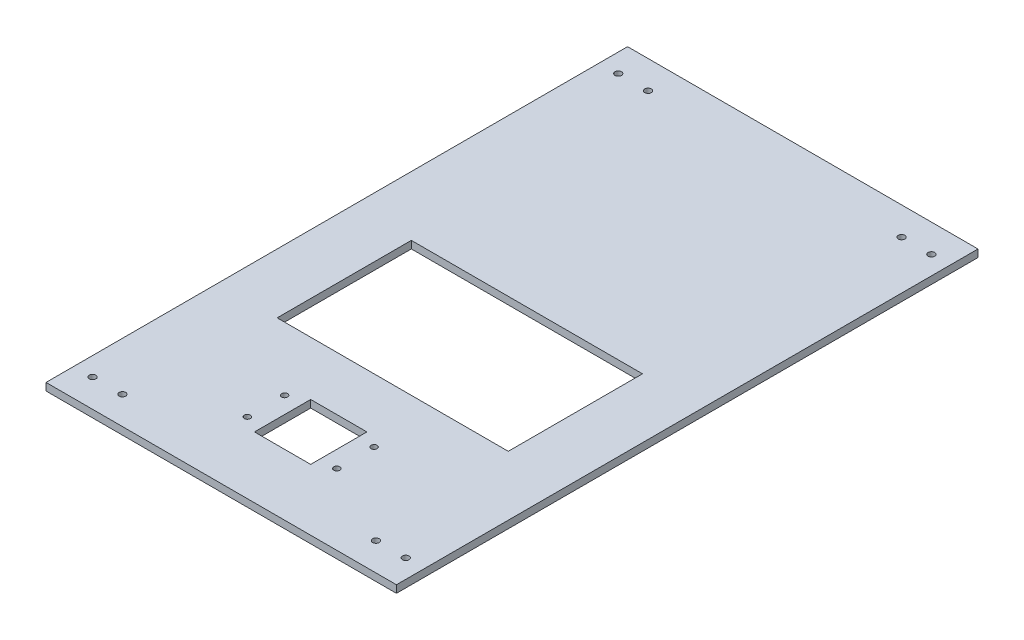
ISO-10303-21;
HEADER;
FILE_DESCRIPTION(('STEP AP214'),'2;1');
FILE_NAME('part.step','',(''),(''),'','','');
FILE_SCHEMA(('AUTOMOTIVE_DESIGN { 1 0 10303 214 1 1 1 1 }'));
ENDSEC;
DATA;
#1=APPLICATION_CONTEXT('core data for automotive mechanical design processes');
#2=APPLICATION_PROTOCOL_DEFINITION('international standard','automotive_design',2000,#1);
#3=PRODUCT_CONTEXT('',#1,'mechanical');
#4=PRODUCT('Part','Part','',(#3));
#5=PRODUCT_RELATED_PRODUCT_CATEGORY('part','',(#4));
#6=PRODUCT_DEFINITION_FORMATION('','',#4);
#7=PRODUCT_DEFINITION_CONTEXT('part definition',#1,'design');
#8=PRODUCT_DEFINITION('design','',#6,#7);
#9=PRODUCT_DEFINITION_SHAPE('','',#8);
#10=(LENGTH_UNIT() NAMED_UNIT(*) SI_UNIT(.MILLI.,.METRE.));
#11=(NAMED_UNIT(*) PLANE_ANGLE_UNIT() SI_UNIT($,.RADIAN.));
#12=(NAMED_UNIT(*) SI_UNIT($,.STERADIAN.) SOLID_ANGLE_UNIT());
#13=UNCERTAINTY_MEASURE_WITH_UNIT(LENGTH_MEASURE(1.E-05),#10,'distance_accuracy_value','');
#14=(GEOMETRIC_REPRESENTATION_CONTEXT(3) GLOBAL_UNCERTAINTY_ASSIGNED_CONTEXT((#13)) GLOBAL_UNIT_ASSIGNED_CONTEXT((#10,
#11,#12)) REPRESENTATION_CONTEXT('',''));
#15=CARTESIAN_POINT('',(0.,0.,0.));
#16=DIRECTION('',(0.,0.,1.));
#17=DIRECTION('',(1.,0.,0.));
#18=AXIS2_PLACEMENT_3D('',#15,#16,#17);
#19=CARTESIAN_POINT('',(0.,-3.175,0.));
#20=DIRECTION('',(0.,1.,0.));
#21=DIRECTION('',(0.,0.,1.));
#22=AXIS2_PLACEMENT_3D('',#19,#20,#21);
#23=PLANE('',#22);
#24=CARTESIAN_POINT('',(38.1,-3.175,155.575));
#25=DIRECTION('',(0.,-1.,0.));
#26=DIRECTION('',(0.,0.,-1.));
#27=AXIS2_PLACEMENT_3D('',#24,#25,#26);
#28=CIRCLE('',#27,2.5527);
#29=CARTESIAN_POINT('',(38.1,-3.175,153.0223));
#30=VERTEX_POINT('',#29);
#31=EDGE_CURVE('E284',#30,#30,#28,.T.);
#32=ORIENTED_EDGE('',*,*,#31,.F.);
#33=EDGE_LOOP('',(#32));
#34=FACE_BOUND('',#33,.T.);
#35=CARTESIAN_POINT('',(-38.1,-3.175,155.575));
#36=DIRECTION('',(0.,-1.,0.));
#37=DIRECTION('',(0.,0.,-1.));
#38=AXIS2_PLACEMENT_3D('',#35,#36,#37);
#39=CIRCLE('',#38,2.5527);
#40=CARTESIAN_POINT('',(-38.1,-3.175,153.0223));
#41=VERTEX_POINT('',#40);
#42=EDGE_CURVE('E273',#41,#41,#39,.T.);
#43=ORIENTED_EDGE('',*,*,#42,.F.);
#44=EDGE_LOOP('',(#43));
#45=FACE_BOUND('',#44,.T.);
#46=CARTESIAN_POINT('',(-38.1,-3.175,187.325));
#47=DIRECTION('',(0.,-1.,0.));
#48=DIRECTION('',(0.,0.,-1.));
#49=AXIS2_PLACEMENT_3D('',#46,#47,#48);
#50=CIRCLE('',#49,2.5527);
#51=CARTESIAN_POINT('',(-38.1,-3.175,184.7723));
#52=VERTEX_POINT('',#51);
#53=EDGE_CURVE('E272',#52,#52,#50,.T.);
#54=ORIENTED_EDGE('',*,*,#53,.F.);
#55=EDGE_LOOP('',(#54));
#56=FACE_BOUND('',#55,.T.);
#57=CARTESIAN_POINT('',(38.1,-3.175,187.325));
#58=DIRECTION('',(0.,-1.,0.));
#59=DIRECTION('',(0.,0.,-1.));
#60=AXIS2_PLACEMENT_3D('',#57,#58,#59);
#61=CIRCLE('',#60,2.5527);
#62=CARTESIAN_POINT('',(38.1,-3.175,184.7723));
#63=VERTEX_POINT('',#62);
#64=EDGE_CURVE('E288',#63,#63,#61,.T.);
#65=ORIENTED_EDGE('',*,*,#64,.F.);
#66=EDGE_LOOP('',(#65));
#67=FACE_BOUND('',#66,.T.);
#68=DIRECTION('',(-1.,0.,0.));
#69=VECTOR('',#68,1.);
#70=CARTESIAN_POINT('',(23.9395,-3.175,195.3895));
#71=LINE('',#70,#69);
#72=CARTESIAN_POINT('',(23.9395,-3.175,195.3895));
#73=VERTEX_POINT('',#72);
#74=CARTESIAN_POINT('',(-23.9395,-3.175,195.3895));
#75=VERTEX_POINT('',#74);
#76=EDGE_CURVE('E154',#73,#75,#71,.T.);
#77=ORIENTED_EDGE('',*,*,#76,.F.);
#78=DIRECTION('',(0.,0.,1.));
#79=VECTOR('',#78,1.);
#80=CARTESIAN_POINT('',(23.9395,-3.175,147.5105));
#81=LINE('',#80,#79);
#82=CARTESIAN_POINT('',(23.9395,-3.175,147.5105));
#83=VERTEX_POINT('',#82);
#84=EDGE_CURVE('E52',#83,#73,#81,.T.);
#85=ORIENTED_EDGE('',*,*,#84,.F.);
#86=DIRECTION('',(-1.,0.,0.));
#87=VECTOR('',#86,1.);
#88=CARTESIAN_POINT('',(23.9395,-3.175,147.5105));
#89=LINE('',#88,#87);
#90=CARTESIAN_POINT('',(-23.9395,-3.175,147.5105));
#91=VERTEX_POINT('',#90);
#92=EDGE_CURVE('E142',#83,#91,#89,.T.);
#93=ORIENTED_EDGE('',*,*,#92,.T.);
#94=DIRECTION('',(0.,0.,1.));
#95=VECTOR('',#94,1.);
#96=CARTESIAN_POINT('',(-23.9395,-3.175,147.5105));
#97=LINE('',#96,#95);
#98=EDGE_CURVE('E145',#91,#75,#97,.T.);
#99=ORIENTED_EDGE('',*,*,#98,.T.);
#100=EDGE_LOOP('',(#77,#85,#93,#99));
#101=FACE_BOUND('',#100,.T.);
#102=CARTESIAN_POINT('',(-107.95,-3.175,223.8375));
#103=DIRECTION('',(0.,-1.,0.));
#104=DIRECTION('',(0.,0.,-1.));
#105=AXIS2_PLACEMENT_3D('',#102,#103,#104);
#106=CIRCLE('',#105,2.8067);
#107=CARTESIAN_POINT('',(-107.95,-3.175,221.0308));
#108=VERTEX_POINT('',#107);
#109=EDGE_CURVE('E160',#108,#108,#106,.T.);
#110=ORIENTED_EDGE('',*,*,#109,.F.);
#111=EDGE_LOOP('',(#110));
#112=FACE_BOUND('',#111,.T.);
#113=CARTESIAN_POINT('',(-133.35,-3.175,223.8375));
#114=DIRECTION('',(0.,-1.,0.));
#115=DIRECTION('',(0.,0.,-1.));
#116=AXIS2_PLACEMENT_3D('',#113,#114,#115);
#117=CIRCLE('',#116,2.8067);
#118=CARTESIAN_POINT('',(-133.35,-3.175,221.0308));
#119=VERTEX_POINT('',#118);
#120=EDGE_CURVE('E169',#119,#119,#117,.T.);
#121=ORIENTED_EDGE('',*,*,#120,.F.);
#122=EDGE_LOOP('',(#121));
#123=FACE_BOUND('',#122,.T.);
#124=CARTESIAN_POINT('',(-133.35,-3.175,-223.8375));
#125=DIRECTION('',(0.,-1.,0.));
#126=DIRECTION('',(0.,0.,-1.));
#127=AXIS2_PLACEMENT_3D('',#124,#125,#126);
#128=CIRCLE('',#127,2.8067);
#129=CARTESIAN_POINT('',(-133.35,-3.175,-226.6442));
#130=VERTEX_POINT('',#129);
#131=EDGE_CURVE('E173',#130,#130,#128,.T.);
#132=ORIENTED_EDGE('',*,*,#131,.F.);
#133=EDGE_LOOP('',(#132));
#134=FACE_BOUND('',#133,.T.);
#135=CARTESIAN_POINT('',(-107.95,-3.175,-223.8375));
#136=DIRECTION('',(0.,-1.,0.));
#137=DIRECTION('',(0.,0.,-1.));
#138=AXIS2_PLACEMENT_3D('',#135,#136,#137);
#139=CIRCLE('',#138,2.8067);
#140=CARTESIAN_POINT('',(-107.95,-3.175,-226.6442));
#141=VERTEX_POINT('',#140);
#142=EDGE_CURVE('E177',#141,#141,#139,.T.);
#143=ORIENTED_EDGE('',*,*,#142,.F.);
#144=EDGE_LOOP('',(#143));
#145=FACE_BOUND('',#144,.T.);
#146=CARTESIAN_POINT('',(107.95,-3.175,-223.8375));
#147=DIRECTION('',(0.,-1.,0.));
#148=DIRECTION('',(0.,0.,-1.));
#149=AXIS2_PLACEMENT_3D('',#146,#147,#148);
#150=CIRCLE('',#149,2.8067);
#151=CARTESIAN_POINT('',(107.95,-3.175,-226.6442));
#152=VERTEX_POINT('',#151);
#153=EDGE_CURVE('E189',#152,#152,#150,.T.);
#154=ORIENTED_EDGE('',*,*,#153,.F.);
#155=EDGE_LOOP('',(#154));
#156=FACE_BOUND('',#155,.T.);
#157=CARTESIAN_POINT('',(133.35,-3.175,223.8375));
#158=DIRECTION('',(0.,-1.,0.));
#159=DIRECTION('',(0.,0.,-1.));
#160=AXIS2_PLACEMENT_3D('',#157,#158,#159);
#161=CIRCLE('',#160,2.8067);
#162=CARTESIAN_POINT('',(133.35,-3.175,221.0308));
#163=VERTEX_POINT('',#162);
#164=EDGE_CURVE('E195',#163,#163,#161,.T.);
#165=ORIENTED_EDGE('',*,*,#164,.F.);
#166=EDGE_LOOP('',(#165));
#167=FACE_BOUND('',#166,.T.);
#168=CARTESIAN_POINT('',(107.95,-3.175,223.8375));
#169=DIRECTION('',(0.,-1.,0.));
#170=DIRECTION('',(0.,0.,-1.));
#171=AXIS2_PLACEMENT_3D('',#168,#169,#170);
#172=CIRCLE('',#171,2.8067);
#173=CARTESIAN_POINT('',(107.95,-3.175,221.0308));
#174=VERTEX_POINT('',#173);
#175=EDGE_CURVE('E201',#174,#174,#172,.T.);
#176=ORIENTED_EDGE('',*,*,#175,.F.);
#177=EDGE_LOOP('',(#176));
#178=FACE_BOUND('',#177,.T.);
#179=DIRECTION('',(1.,0.,0.));
#180=VECTOR('',#179,1.);
#181=CARTESIAN_POINT('',(-98.425,-3.175,101.6));
#182=LINE('',#181,#180);
#183=CARTESIAN_POINT('',(-98.425,-3.175,101.6));
#184=VERTEX_POINT('',#183);
#185=CARTESIAN_POINT('',(98.425,-3.175,101.6));
#186=VERTEX_POINT('',#185);
#187=EDGE_CURVE('E216',#184,#186,#182,.T.);
#188=ORIENTED_EDGE('',*,*,#187,.T.);
#189=DIRECTION('',(0.,0.,-1.));
#190=VECTOR('',#189,1.);
#191=CARTESIAN_POINT('',(98.425,-3.175,-12.7000000000001));
#192=LINE('',#191,#190);
#193=CARTESIAN_POINT('',(98.425,-3.175,-12.7000000000001));
#194=VERTEX_POINT('',#193);
#195=EDGE_CURVE('E207',#186,#194,#192,.T.);
#196=ORIENTED_EDGE('',*,*,#195,.T.);
#197=DIRECTION('',(-1.,0.,0.));
#198=VECTOR('',#197,1.);
#199=CARTESIAN_POINT('',(-98.425,-3.175,-12.7000000000001));
#200=LINE('',#199,#198);
#201=CARTESIAN_POINT('',(-98.425,-3.175,-12.7000000000001));
#202=VERTEX_POINT('',#201);
#203=EDGE_CURVE('E210',#194,#202,#200,.T.);
#204=ORIENTED_EDGE('',*,*,#203,.T.);
#205=DIRECTION('',(0.,0.,1.));
#206=VECTOR('',#205,1.);
#207=CARTESIAN_POINT('',(-98.425,-3.175,-12.7000000000001));
#208=LINE('',#207,#206);
#209=EDGE_CURVE('E213',#202,#184,#208,.T.);
#210=ORIENTED_EDGE('',*,*,#209,.T.);
#211=EDGE_LOOP('',(#188,#196,#204,#210));
#212=FACE_BOUND('',#211,.T.);
#213=DIRECTION('',(1.,0.,0.));
#214=VECTOR('',#213,1.);
#215=CARTESIAN_POINT('',(0.,-3.175,247.65));
#216=LINE('',#215,#214);
#217=CARTESIAN_POINT('',(-149.225,-3.175,247.65));
#218=VERTEX_POINT('',#217);
#219=CARTESIAN_POINT('',(149.225,-3.175,247.65));
#220=VERTEX_POINT('',#219);
#221=EDGE_CURVE('E239',#218,#220,#216,.T.);
#222=ORIENTED_EDGE('',*,*,#221,.F.);
#223=DIRECTION('',(0.,0.,-1.));
#224=VECTOR('',#223,1.);
#225=CARTESIAN_POINT('',(-149.225,-3.175,0.));
#226=LINE('',#225,#224);
#227=CARTESIAN_POINT('',(-149.225,-3.175,-247.65));
#228=VERTEX_POINT('',#227);
#229=EDGE_CURVE('E244',#218,#228,#226,.T.);
#230=ORIENTED_EDGE('',*,*,#229,.T.);
#231=DIRECTION('',(1.,0.,0.));
#232=VECTOR('',#231,1.);
#233=CARTESIAN_POINT('',(0.,-3.175,-247.65));
#234=LINE('',#233,#232);
#235=CARTESIAN_POINT('',(149.225,-3.175,-247.65));
#236=VERTEX_POINT('',#235);
#237=EDGE_CURVE('E258',#228,#236,#234,.T.);
#238=ORIENTED_EDGE('',*,*,#237,.T.);
#239=DIRECTION('',(0.,0.,-1.));
#240=VECTOR('',#239,1.);
#241=CARTESIAN_POINT('',(149.225,-3.175,0.));
#242=LINE('',#241,#240);
#243=EDGE_CURVE('E255',#220,#236,#242,.T.);
#244=ORIENTED_EDGE('',*,*,#243,.F.);
#245=EDGE_LOOP('',(#222,#230,#238,#244));
#246=FACE_BOUND('',#245,.T.);
#247=CARTESIAN_POINT('',(133.35,-3.175,-223.8375));
#248=DIRECTION('',(0.,-1.,0.));
#249=DIRECTION('',(0.,0.,-1.));
#250=AXIS2_PLACEMENT_3D('',#247,#248,#249);
#251=CIRCLE('',#250,2.8067);
#252=CARTESIAN_POINT('',(133.35,-3.175,-226.6442));
#253=VERTEX_POINT('',#252);
#254=EDGE_CURVE('E183',#253,#253,#251,.T.);
#255=ORIENTED_EDGE('',*,*,#254,.F.);
#256=EDGE_LOOP('',(#255));
#257=FACE_BOUND('',#256,.T.);
#258=ADVANCED_FACE('F35',(#34,#45,#56,#67,#101,#112,#123,#134,#145,#156,#167,#178,#212,#246,
#257),#23,.F.);
#259=CARTESIAN_POINT('',(0.,3.175,247.65));
#260=DIRECTION('',(0.,0.,-1.));
#261=DIRECTION('',(-1.,0.,0.));
#262=AXIS2_PLACEMENT_3D('',#259,#260,#261);
#263=PLANE('',#262);
#264=ORIENTED_EDGE('',*,*,#221,.T.);
#265=DIRECTION('',(0.,-1.,0.));
#266=VECTOR('',#265,1.);
#267=CARTESIAN_POINT('',(149.225,3.175,247.65));
#268=LINE('',#267,#266);
#269=CARTESIAN_POINT('',(149.225,3.175,247.65));
#270=VERTEX_POINT('',#269);
#271=EDGE_CURVE('E11',#270,#220,#268,.T.);
#272=ORIENTED_EDGE('',*,*,#271,.F.);
#273=DIRECTION('',(1.,0.,0.));
#274=VECTOR('',#273,1.);
#275=CARTESIAN_POINT('',(0.,3.175,247.65));
#276=LINE('',#275,#274);
#277=CARTESIAN_POINT('',(-149.225,3.175,247.65));
#278=VERTEX_POINT('',#277);
#279=EDGE_CURVE('E240',#278,#270,#276,.T.);
#280=ORIENTED_EDGE('',*,*,#279,.F.);
#281=DIRECTION('',(0.,-1.,0.));
#282=VECTOR('',#281,1.);
#283=CARTESIAN_POINT('',(-149.225,3.175,247.65));
#284=LINE('',#283,#282);
#285=EDGE_CURVE('E252',#278,#218,#284,.T.);
#286=ORIENTED_EDGE('',*,*,#285,.T.);
#287=EDGE_LOOP('',(#264,#272,#280,#286));
#288=FACE_BOUND('',#287,.T.);
#289=ADVANCED_FACE('F37',(#288),#263,.F.);
#290=CARTESIAN_POINT('',(149.225,3.175,0.));
#291=DIRECTION('',(-1.,0.,0.));
#292=DIRECTION('',(0.,0.,1.));
#293=AXIS2_PLACEMENT_3D('',#290,#291,#292);
#294=PLANE('',#293);
#295=ORIENTED_EDGE('',*,*,#243,.T.);
#296=DIRECTION('',(0.,-1.,0.));
#297=VECTOR('',#296,1.);
#298=CARTESIAN_POINT('',(149.225,3.175,-247.65));
#299=LINE('',#298,#297);
#300=CARTESIAN_POINT('',(149.225,3.175,-247.65));
#301=VERTEX_POINT('',#300);
#302=EDGE_CURVE('E44',#301,#236,#299,.T.);
#303=ORIENTED_EDGE('',*,*,#302,.F.);
#304=DIRECTION('',(0.,0.,-1.));
#305=VECTOR('',#304,1.);
#306=CARTESIAN_POINT('',(149.225,3.175,0.));
#307=LINE('',#306,#305);
#308=EDGE_CURVE('E243',#270,#301,#307,.T.);
#309=ORIENTED_EDGE('',*,*,#308,.F.);
#310=ORIENTED_EDGE('',*,*,#271,.T.);
#311=EDGE_LOOP('',(#295,#303,#309,#310));
#312=FACE_BOUND('',#311,.T.);
#313=ADVANCED_FACE('F320',(#312),#294,.F.);
#314=CARTESIAN_POINT('',(0.,3.175,-247.65));
#315=DIRECTION('',(0.,0.,-1.));
#316=DIRECTION('',(-1.,0.,0.));
#317=AXIS2_PLACEMENT_3D('',#314,#315,#316);
#318=PLANE('',#317);
#319=ORIENTED_EDGE('',*,*,#237,.F.);
#320=DIRECTION('',(0.,-1.,0.));
#321=VECTOR('',#320,1.);
#322=CARTESIAN_POINT('',(-149.225,3.175,-247.65));
#323=LINE('',#322,#321);
#324=CARTESIAN_POINT('',(-149.225,3.175,-247.65));
#325=VERTEX_POINT('',#324);
#326=EDGE_CURVE('E264',#325,#228,#323,.T.);
#327=ORIENTED_EDGE('',*,*,#326,.F.);
#328=DIRECTION('',(1.,0.,0.));
#329=VECTOR('',#328,1.);
#330=CARTESIAN_POINT('',(0.,3.175,-247.65));
#331=LINE('',#330,#329);
#332=EDGE_CURVE('E246',#325,#301,#331,.T.);
#333=ORIENTED_EDGE('',*,*,#332,.T.);
#334=ORIENTED_EDGE('',*,*,#302,.T.);
#335=EDGE_LOOP('',(#319,#327,#333,#334));
#336=FACE_BOUND('',#335,.T.);
#337=ADVANCED_FACE('F309',(#336),#318,.T.);
#338=CARTESIAN_POINT('',(-149.225,3.175,0.));
#339=DIRECTION('',(-1.,0.,0.));
#340=DIRECTION('',(0.,0.,1.));
#341=AXIS2_PLACEMENT_3D('',#338,#339,#340);
#342=PLANE('',#341);
#343=ORIENTED_EDGE('',*,*,#229,.F.);
#344=ORIENTED_EDGE('',*,*,#285,.F.);
#345=DIRECTION('',(0.,0.,-1.));
#346=VECTOR('',#345,1.);
#347=CARTESIAN_POINT('',(-149.225,3.175,0.));
#348=LINE('',#347,#346);
#349=EDGE_CURVE('E249',#278,#325,#348,.T.);
#350=ORIENTED_EDGE('',*,*,#349,.T.);
#351=ORIENTED_EDGE('',*,*,#326,.T.);
#352=EDGE_LOOP('',(#343,#344,#350,#351));
#353=FACE_BOUND('',#352,.T.);
#354=ADVANCED_FACE('F299',(#353),#342,.T.);
#355=CARTESIAN_POINT('',(0.,3.175,0.));
#356=DIRECTION('',(0.,1.,0.));
#357=DIRECTION('',(0.,0.,1.));
#358=AXIS2_PLACEMENT_3D('',#355,#356,#357);
#359=PLANE('',#358);
#360=CARTESIAN_POINT('',(38.1,3.175,155.575));
#361=DIRECTION('',(0.,1.,0.));
#362=DIRECTION('',(0.,0.,1.));
#363=AXIS2_PLACEMENT_3D('',#360,#361,#362);
#364=CIRCLE('',#363,2.5527);
#365=CARTESIAN_POINT('',(38.1,3.175,158.1277));
#366=VERTEX_POINT('',#365);
#367=EDGE_CURVE('E39',#366,#366,#364,.T.);
#368=ORIENTED_EDGE('',*,*,#367,.F.);
#369=EDGE_LOOP('',(#368));
#370=FACE_BOUND('',#369,.T.);
#371=CARTESIAN_POINT('',(-38.1,3.175,155.575));
#372=DIRECTION('',(0.,1.,0.));
#373=DIRECTION('',(0.,0.,1.));
#374=AXIS2_PLACEMENT_3D('',#371,#372,#373);
#375=CIRCLE('',#374,2.5527);
#376=CARTESIAN_POINT('',(-38.1,3.175,158.1277));
#377=VERTEX_POINT('',#376);
#378=EDGE_CURVE('E270',#377,#377,#375,.T.);
#379=ORIENTED_EDGE('',*,*,#378,.F.);
#380=EDGE_LOOP('',(#379));
#381=FACE_BOUND('',#380,.T.);
#382=CARTESIAN_POINT('',(-38.1,3.175,187.325));
#383=DIRECTION('',(0.,1.,0.));
#384=DIRECTION('',(0.,0.,1.));
#385=AXIS2_PLACEMENT_3D('',#382,#383,#384);
#386=CIRCLE('',#385,2.5527);
#387=CARTESIAN_POINT('',(-38.1,3.175,189.8777));
#388=VERTEX_POINT('',#387);
#389=EDGE_CURVE('E277',#388,#388,#386,.T.);
#390=ORIENTED_EDGE('',*,*,#389,.F.);
#391=EDGE_LOOP('',(#390));
#392=FACE_BOUND('',#391,.T.);
#393=CARTESIAN_POINT('',(38.1,3.175,187.325));
#394=DIRECTION('',(0.,1.,0.));
#395=DIRECTION('',(0.,0.,1.));
#396=AXIS2_PLACEMENT_3D('',#393,#394,#395);
#397=CIRCLE('',#396,2.5527);
#398=CARTESIAN_POINT('',(38.1,3.175,189.8777));
#399=VERTEX_POINT('',#398);
#400=EDGE_CURVE('E148',#399,#399,#397,.T.);
#401=ORIENTED_EDGE('',*,*,#400,.F.);
#402=EDGE_LOOP('',(#401));
#403=FACE_BOUND('',#402,.T.);
#404=DIRECTION('',(0.,0.,1.));
#405=VECTOR('',#404,1.);
#406=CARTESIAN_POINT('',(23.9395,3.175,147.5105));
#407=LINE('',#406,#405);
#408=CARTESIAN_POINT('',(23.9395,3.175,147.5105));
#409=VERTEX_POINT('',#408);
#410=CARTESIAN_POINT('',(23.9395,3.175,195.3895));
#411=VERTEX_POINT('',#410);
#412=EDGE_CURVE('E128',#409,#411,#407,.T.);
#413=ORIENTED_EDGE('',*,*,#412,.T.);
#414=DIRECTION('',(-1.,0.,0.));
#415=VECTOR('',#414,1.);
#416=CARTESIAN_POINT('',(23.9395,3.175,195.3895));
#417=LINE('',#416,#415);
#418=CARTESIAN_POINT('',(-23.9395,3.175,195.3895));
#419=VERTEX_POINT('',#418);
#420=EDGE_CURVE('E134',#411,#419,#417,.T.);
#421=ORIENTED_EDGE('',*,*,#420,.T.);
#422=DIRECTION('',(0.,0.,1.));
#423=VECTOR('',#422,1.);
#424=CARTESIAN_POINT('',(-23.9395,3.175,147.5105));
#425=LINE('',#424,#423);
#426=CARTESIAN_POINT('',(-23.9395,3.175,147.5105));
#427=VERTEX_POINT('',#426);
#428=EDGE_CURVE('E138',#427,#419,#425,.T.);
#429=ORIENTED_EDGE('',*,*,#428,.F.);
#430=DIRECTION('',(-1.,0.,0.));
#431=VECTOR('',#430,1.);
#432=CARTESIAN_POINT('',(23.9395,3.175,147.5105));
#433=LINE('',#432,#431);
#434=EDGE_CURVE('E131',#409,#427,#433,.T.);
#435=ORIENTED_EDGE('',*,*,#434,.F.);
#436=EDGE_LOOP('',(#413,#421,#429,#435));
#437=FACE_BOUND('',#436,.T.);
#438=CARTESIAN_POINT('',(-107.95,3.175,223.8375));
#439=DIRECTION('',(0.,1.,0.));
#440=DIRECTION('',(0.,0.,1.));
#441=AXIS2_PLACEMENT_3D('',#438,#439,#440);
#442=CIRCLE('',#441,2.8067);
#443=CARTESIAN_POINT('',(-107.95,3.175,226.6442));
#444=VERTEX_POINT('',#443);
#445=EDGE_CURVE('E166',#444,#444,#442,.T.);
#446=ORIENTED_EDGE('',*,*,#445,.F.);
#447=EDGE_LOOP('',(#446));
#448=FACE_BOUND('',#447,.T.);
#449=CARTESIAN_POINT('',(-133.35,3.175,223.8375));
#450=DIRECTION('',(0.,1.,0.));
#451=DIRECTION('',(0.,0.,1.));
#452=AXIS2_PLACEMENT_3D('',#449,#450,#451);
#453=CIRCLE('',#452,2.8067);
#454=CARTESIAN_POINT('',(-133.35,3.175,226.6442));
#455=VERTEX_POINT('',#454);
#456=EDGE_CURVE('E172',#455,#455,#453,.T.);
#457=ORIENTED_EDGE('',*,*,#456,.F.);
#458=EDGE_LOOP('',(#457));
#459=FACE_BOUND('',#458,.T.);
#460=CARTESIAN_POINT('',(-133.35,3.175,-223.8375));
#461=DIRECTION('',(0.,1.,0.));
#462=DIRECTION('',(0.,0.,1.));
#463=AXIS2_PLACEMENT_3D('',#460,#461,#462);
#464=CIRCLE('',#463,2.8067);
#465=CARTESIAN_POINT('',(-133.35,3.175,-221.0308));
#466=VERTEX_POINT('',#465);
#467=EDGE_CURVE('E176',#466,#466,#464,.T.);
#468=ORIENTED_EDGE('',*,*,#467,.F.);
#469=EDGE_LOOP('',(#468));
#470=FACE_BOUND('',#469,.T.);
#471=CARTESIAN_POINT('',(-107.95,3.175,-223.8375));
#472=DIRECTION('',(0.,1.,0.));
#473=DIRECTION('',(0.,0.,1.));
#474=AXIS2_PLACEMENT_3D('',#471,#472,#473);
#475=CIRCLE('',#474,2.8067);
#476=CARTESIAN_POINT('',(-107.95,3.175,-221.0308));
#477=VERTEX_POINT('',#476);
#478=EDGE_CURVE('E180',#477,#477,#475,.T.);
#479=ORIENTED_EDGE('',*,*,#478,.F.);
#480=EDGE_LOOP('',(#479));
#481=FACE_BOUND('',#480,.T.);
#482=CARTESIAN_POINT('',(133.35,3.175,-223.8375));
#483=DIRECTION('',(0.,1.,0.));
#484=DIRECTION('',(0.,0.,1.));
#485=AXIS2_PLACEMENT_3D('',#482,#483,#484);
#486=CIRCLE('',#485,2.8067);
#487=CARTESIAN_POINT('',(133.35,3.175,-221.0308));
#488=VERTEX_POINT('',#487);
#489=EDGE_CURVE('E186',#488,#488,#486,.T.);
#490=ORIENTED_EDGE('',*,*,#489,.F.);
#491=EDGE_LOOP('',(#490));
#492=FACE_BOUND('',#491,.T.);
#493=CARTESIAN_POINT('',(107.95,3.175,-223.8375));
#494=DIRECTION('',(0.,1.,0.));
#495=DIRECTION('',(0.,0.,1.));
#496=AXIS2_PLACEMENT_3D('',#493,#494,#495);
#497=CIRCLE('',#496,2.8067);
#498=CARTESIAN_POINT('',(107.95,3.175,-221.0308));
#499=VERTEX_POINT('',#498);
#500=EDGE_CURVE('E192',#499,#499,#497,.T.);
#501=ORIENTED_EDGE('',*,*,#500,.F.);
#502=EDGE_LOOP('',(#501));
#503=FACE_BOUND('',#502,.T.);
#504=CARTESIAN_POINT('',(133.35,3.175,223.8375));
#505=DIRECTION('',(0.,1.,0.));
#506=DIRECTION('',(0.,0.,1.));
#507=AXIS2_PLACEMENT_3D('',#504,#505,#506);
#508=CIRCLE('',#507,2.8067);
#509=CARTESIAN_POINT('',(133.35,3.175,226.6442));
#510=VERTEX_POINT('',#509);
#511=EDGE_CURVE('E198',#510,#510,#508,.T.);
#512=ORIENTED_EDGE('',*,*,#511,.F.);
#513=EDGE_LOOP('',(#512));
#514=FACE_BOUND('',#513,.T.);
#515=CARTESIAN_POINT('',(107.95,3.175,223.8375));
#516=DIRECTION('',(0.,1.,0.));
#517=DIRECTION('',(0.,0.,1.));
#518=AXIS2_PLACEMENT_3D('',#515,#516,#517);
#519=CIRCLE('',#518,2.8067);
#520=CARTESIAN_POINT('',(107.95,3.175,226.6442));
#521=VERTEX_POINT('',#520);
#522=EDGE_CURVE('E204',#521,#521,#519,.T.);
#523=ORIENTED_EDGE('',*,*,#522,.F.);
#524=EDGE_LOOP('',(#523));
#525=FACE_BOUND('',#524,.T.);
#526=DIRECTION('',(0.,0.,-1.));
#527=VECTOR('',#526,1.);
#528=CARTESIAN_POINT('',(98.425,3.175,0.));
#529=LINE('',#528,#527);
#530=CARTESIAN_POINT('',(98.425,3.175,101.6));
#531=VERTEX_POINT('',#530);
#532=CARTESIAN_POINT('',(98.425,3.175,-12.7000000000001));
#533=VERTEX_POINT('',#532);
#534=EDGE_CURVE('E236',#531,#533,#529,.T.);
#535=ORIENTED_EDGE('',*,*,#534,.F.);
#536=DIRECTION('',(1.,0.,0.));
#537=VECTOR('',#536,1.);
#538=CARTESIAN_POINT('',(0.,3.175,101.6));
#539=LINE('',#538,#537);
#540=CARTESIAN_POINT('',(-98.425,3.175,101.6));
#541=VERTEX_POINT('',#540);
#542=EDGE_CURVE('E234',#541,#531,#539,.T.);
#543=ORIENTED_EDGE('',*,*,#542,.F.);
#544=DIRECTION('',(0.,0.,1.));
#545=VECTOR('',#544,1.);
#546=CARTESIAN_POINT('',(-98.425,3.175,0.));
#547=LINE('',#546,#545);
#548=CARTESIAN_POINT('',(-98.425,3.175,-12.7000000000001));
#549=VERTEX_POINT('',#548);
#550=EDGE_CURVE('E232',#549,#541,#547,.T.);
#551=ORIENTED_EDGE('',*,*,#550,.F.);
#552=DIRECTION('',(-1.,0.,0.));
#553=VECTOR('',#552,1.);
#554=CARTESIAN_POINT('',(0.,3.175,-12.7000000000001));
#555=LINE('',#554,#553);
#556=EDGE_CURVE('E223',#533,#549,#555,.T.);
#557=ORIENTED_EDGE('',*,*,#556,.F.);
#558=EDGE_LOOP('',(#535,#543,#551,#557));
#559=FACE_BOUND('',#558,.T.);
#560=ORIENTED_EDGE('',*,*,#279,.T.);
#561=ORIENTED_EDGE('',*,*,#308,.T.);
#562=ORIENTED_EDGE('',*,*,#332,.F.);
#563=ORIENTED_EDGE('',*,*,#349,.F.);
#564=EDGE_LOOP('',(#560,#561,#562,#563));
#565=FACE_BOUND('',#564,.T.);
#566=ADVANCED_FACE('F140',(#370,#381,#392,#403,#437,#448,#459,#470,#481,#492,#503,#514,#525,
#559,#565),#359,.T.);
#567=CARTESIAN_POINT('',(98.425,-3.175,-12.7000000000001));
#568=DIRECTION('',(1.,0.,0.));
#569=DIRECTION('',(0.,0.,-1.));
#570=AXIS2_PLACEMENT_3D('',#567,#568,#569);
#571=PLANE('',#570);
#572=ORIENTED_EDGE('',*,*,#534,.T.);
#573=DIRECTION('',(0.,1.,0.));
#574=VECTOR('',#573,1.);
#575=CARTESIAN_POINT('',(98.425,-3.175,-12.7000000000001));
#576=LINE('',#575,#574);
#577=EDGE_CURVE('E219',#194,#533,#576,.T.);
#578=ORIENTED_EDGE('',*,*,#577,.F.);
#579=ORIENTED_EDGE('',*,*,#195,.F.);
#580=DIRECTION('',(0.,1.,0.));
#581=VECTOR('',#580,1.);
#582=CARTESIAN_POINT('',(98.425,-3.175,101.6));
#583=LINE('',#582,#581);
#584=EDGE_CURVE('E220',#186,#531,#583,.T.);
#585=ORIENTED_EDGE('',*,*,#584,.T.);
#586=EDGE_LOOP('',(#572,#578,#579,#585));
#587=FACE_BOUND('',#586,.T.);
#588=ADVANCED_FACE('F298',(#587),#571,.F.);
#589=CARTESIAN_POINT('',(-98.425,-3.175,101.6));
#590=DIRECTION('',(0.,0.,1.));
#591=DIRECTION('',(1.,0.,0.));
#592=AXIS2_PLACEMENT_3D('',#589,#590,#591);
#593=PLANE('',#592);
#594=ORIENTED_EDGE('',*,*,#542,.T.);
#595=ORIENTED_EDGE('',*,*,#584,.F.);
#596=ORIENTED_EDGE('',*,*,#187,.F.);
#597=DIRECTION('',(0.,1.,0.));
#598=VECTOR('',#597,1.);
#599=CARTESIAN_POINT('',(-98.425,-3.175,101.6));
#600=LINE('',#599,#598);
#601=EDGE_CURVE('E224',#184,#541,#600,.T.);
#602=ORIENTED_EDGE('',*,*,#601,.T.);
#603=EDGE_LOOP('',(#594,#595,#596,#602));
#604=FACE_BOUND('',#603,.T.);
#605=ADVANCED_FACE('F306',(#604),#593,.F.);
#606=CARTESIAN_POINT('',(-98.425,-3.175,-12.7000000000001));
#607=DIRECTION('',(-1.,0.,0.));
#608=DIRECTION('',(0.,0.,1.));
#609=AXIS2_PLACEMENT_3D('',#606,#607,#608);
#610=PLANE('',#609);
#611=ORIENTED_EDGE('',*,*,#550,.T.);
#612=ORIENTED_EDGE('',*,*,#601,.F.);
#613=ORIENTED_EDGE('',*,*,#209,.F.);
#614=DIRECTION('',(0.,1.,0.));
#615=VECTOR('',#614,1.);
#616=CARTESIAN_POINT('',(-98.425,-3.175,-12.7000000000001));
#617=LINE('',#616,#615);
#618=EDGE_CURVE('E227',#202,#549,#617,.T.);
#619=ORIENTED_EDGE('',*,*,#618,.T.);
#620=EDGE_LOOP('',(#611,#612,#613,#619));
#621=FACE_BOUND('',#620,.T.);
#622=ADVANCED_FACE('F372',(#621),#610,.F.);
#623=CARTESIAN_POINT('',(-98.425,-3.175,-12.7000000000001));
#624=DIRECTION('',(0.,0.,-1.));
#625=DIRECTION('',(-1.,0.,0.));
#626=AXIS2_PLACEMENT_3D('',#623,#624,#625);
#627=PLANE('',#626);
#628=ORIENTED_EDGE('',*,*,#556,.T.);
#629=ORIENTED_EDGE('',*,*,#618,.F.);
#630=ORIENTED_EDGE('',*,*,#203,.F.);
#631=ORIENTED_EDGE('',*,*,#577,.T.);
#632=EDGE_LOOP('',(#628,#629,#630,#631));
#633=FACE_BOUND('',#632,.T.);
#634=ADVANCED_FACE('F368',(#633),#627,.F.);
#635=CARTESIAN_POINT('',(107.95,-3.175,223.8375));
#636=DIRECTION('',(0.,-1.,0.));
#637=DIRECTION('',(0.,0.,-1.));
#638=AXIS2_PLACEMENT_3D('',#635,#636,#637);
#639=CYLINDRICAL_SURFACE('',#638,2.8067);
#640=ORIENTED_EDGE('',*,*,#522,.T.);
#641=EDGE_LOOP('',(#640));
#642=FACE_BOUND('',#641,.T.);
#643=ORIENTED_EDGE('',*,*,#175,.T.);
#644=EDGE_LOOP('',(#643));
#645=FACE_BOUND('',#644,.T.);
#646=ADVANCED_FACE('F364',(#642,#645),#639,.F.);
#647=CARTESIAN_POINT('',(133.35,-3.175,223.8375));
#648=DIRECTION('',(0.,-1.,0.));
#649=DIRECTION('',(0.,0.,-1.));
#650=AXIS2_PLACEMENT_3D('',#647,#648,#649);
#651=CYLINDRICAL_SURFACE('',#650,2.8067);
#652=ORIENTED_EDGE('',*,*,#511,.T.);
#653=EDGE_LOOP('',(#652));
#654=FACE_BOUND('',#653,.T.);
#655=ORIENTED_EDGE('',*,*,#164,.T.);
#656=EDGE_LOOP('',(#655));
#657=FACE_BOUND('',#656,.T.);
#658=ADVANCED_FACE('F357',(#654,#657),#651,.F.);
#659=CARTESIAN_POINT('',(107.95,-3.175,-223.8375));
#660=DIRECTION('',(0.,-1.,0.));
#661=DIRECTION('',(0.,0.,-1.));
#662=AXIS2_PLACEMENT_3D('',#659,#660,#661);
#663=CYLINDRICAL_SURFACE('',#662,2.8067);
#664=ORIENTED_EDGE('',*,*,#500,.T.);
#665=EDGE_LOOP('',(#664));
#666=FACE_BOUND('',#665,.T.);
#667=ORIENTED_EDGE('',*,*,#153,.T.);
#668=EDGE_LOOP('',(#667));
#669=FACE_BOUND('',#668,.T.);
#670=ADVANCED_FACE('F347',(#666,#669),#663,.F.);
#671=CARTESIAN_POINT('',(133.35,-3.175,-223.8375));
#672=DIRECTION('',(0.,-1.,0.));
#673=DIRECTION('',(0.,0.,-1.));
#674=AXIS2_PLACEMENT_3D('',#671,#672,#673);
#675=CYLINDRICAL_SURFACE('',#674,2.8067);
#676=ORIENTED_EDGE('',*,*,#489,.T.);
#677=EDGE_LOOP('',(#676));
#678=FACE_BOUND('',#677,.T.);
#679=ORIENTED_EDGE('',*,*,#254,.T.);
#680=EDGE_LOOP('',(#679));
#681=FACE_BOUND('',#680,.T.);
#682=ADVANCED_FACE('F344',(#678,#681),#675,.F.);
#683=CARTESIAN_POINT('',(-107.95,-3.175,-223.8375));
#684=DIRECTION('',(0.,-1.,0.));
#685=DIRECTION('',(0.,0.,-1.));
#686=AXIS2_PLACEMENT_3D('',#683,#684,#685);
#687=CYLINDRICAL_SURFACE('',#686,2.8067);
#688=ORIENTED_EDGE('',*,*,#478,.T.);
#689=EDGE_LOOP('',(#688));
#690=FACE_BOUND('',#689,.T.);
#691=ORIENTED_EDGE('',*,*,#142,.T.);
#692=EDGE_LOOP('',(#691));
#693=FACE_BOUND('',#692,.T.);
#694=ADVANCED_FACE('F346',(#690,#693),#687,.F.);
#695=CARTESIAN_POINT('',(-133.35,-3.175,-223.8375));
#696=DIRECTION('',(0.,-1.,0.));
#697=DIRECTION('',(0.,0.,-1.));
#698=AXIS2_PLACEMENT_3D('',#695,#696,#697);
#699=CYLINDRICAL_SURFACE('',#698,2.8067);
#700=ORIENTED_EDGE('',*,*,#467,.T.);
#701=EDGE_LOOP('',(#700));
#702=FACE_BOUND('',#701,.T.);
#703=ORIENTED_EDGE('',*,*,#131,.T.);
#704=EDGE_LOOP('',(#703));
#705=FACE_BOUND('',#704,.T.);
#706=ADVANCED_FACE('F354',(#702,#705),#699,.F.);
#707=CARTESIAN_POINT('',(-133.35,-3.175,223.8375));
#708=DIRECTION('',(0.,-1.,0.));
#709=DIRECTION('',(0.,0.,-1.));
#710=AXIS2_PLACEMENT_3D('',#707,#708,#709);
#711=CYLINDRICAL_SURFACE('',#710,2.8067);
#712=ORIENTED_EDGE('',*,*,#456,.T.);
#713=EDGE_LOOP('',(#712));
#714=FACE_BOUND('',#713,.T.);
#715=ORIENTED_EDGE('',*,*,#120,.T.);
#716=EDGE_LOOP('',(#715));
#717=FACE_BOUND('',#716,.T.);
#718=ADVANCED_FACE('F424',(#714,#717),#711,.F.);
#719=CARTESIAN_POINT('',(-107.95,-3.175,223.8375));
#720=DIRECTION('',(0.,-1.,0.));
#721=DIRECTION('',(0.,0.,-1.));
#722=AXIS2_PLACEMENT_3D('',#719,#720,#721);
#723=CYLINDRICAL_SURFACE('',#722,2.8067);
#724=ORIENTED_EDGE('',*,*,#445,.T.);
#725=EDGE_LOOP('',(#724));
#726=FACE_BOUND('',#725,.T.);
#727=ORIENTED_EDGE('',*,*,#109,.T.);
#728=EDGE_LOOP('',(#727));
#729=FACE_BOUND('',#728,.T.);
#730=ADVANCED_FACE('F433',(#726,#729),#723,.F.);
#731=CARTESIAN_POINT('',(23.9395,3.175,147.5105));
#732=DIRECTION('',(1.,0.,0.));
#733=DIRECTION('',(0.,0.,-1.));
#734=AXIS2_PLACEMENT_3D('',#731,#732,#733);
#735=PLANE('',#734);
#736=ORIENTED_EDGE('',*,*,#84,.T.);
#737=DIRECTION('',(0.,-1.,0.));
#738=VECTOR('',#737,1.);
#739=CARTESIAN_POINT('',(23.9395,3.175,195.3895));
#740=LINE('',#739,#738);
#741=EDGE_CURVE('E125',#411,#73,#740,.T.);
#742=ORIENTED_EDGE('',*,*,#741,.F.);
#743=ORIENTED_EDGE('',*,*,#412,.F.);
#744=DIRECTION('',(0.,-1.,0.));
#745=VECTOR('',#744,1.);
#746=CARTESIAN_POINT('',(23.9395,3.175,147.5105));
#747=LINE('',#746,#745);
#748=EDGE_CURVE('E158',#409,#83,#747,.T.);
#749=ORIENTED_EDGE('',*,*,#748,.T.);
#750=EDGE_LOOP('',(#736,#742,#743,#749));
#751=FACE_BOUND('',#750,.T.);
#752=ADVANCED_FACE('F126',(#751),#735,.F.);
#753=CARTESIAN_POINT('',(23.9395,3.175,147.5105));
#754=DIRECTION('',(0.,0.,1.));
#755=DIRECTION('',(1.,0.,0.));
#756=AXIS2_PLACEMENT_3D('',#753,#754,#755);
#757=PLANE('',#756);
#758=ORIENTED_EDGE('',*,*,#92,.F.);
#759=ORIENTED_EDGE('',*,*,#748,.F.);
#760=ORIENTED_EDGE('',*,*,#434,.T.);
#761=DIRECTION('',(0.,-1.,0.));
#762=VECTOR('',#761,1.);
#763=CARTESIAN_POINT('',(-23.9395,3.175,147.5105));
#764=LINE('',#763,#762);
#765=EDGE_CURVE('E161',#427,#91,#764,.T.);
#766=ORIENTED_EDGE('',*,*,#765,.T.);
#767=EDGE_LOOP('',(#758,#759,#760,#766));
#768=FACE_BOUND('',#767,.T.);
#769=ADVANCED_FACE('F452',(#768),#757,.T.);
#770=CARTESIAN_POINT('',(-23.9395,3.175,147.5105));
#771=DIRECTION('',(1.,0.,0.));
#772=DIRECTION('',(0.,0.,-1.));
#773=AXIS2_PLACEMENT_3D('',#770,#771,#772);
#774=PLANE('',#773);
#775=ORIENTED_EDGE('',*,*,#98,.F.);
#776=ORIENTED_EDGE('',*,*,#765,.F.);
#777=ORIENTED_EDGE('',*,*,#428,.T.);
#778=DIRECTION('',(0.,-1.,0.));
#779=VECTOR('',#778,1.);
#780=CARTESIAN_POINT('',(-23.9395,3.175,195.3895));
#781=LINE('',#780,#779);
#782=EDGE_CURVE('E60',#419,#75,#781,.T.);
#783=ORIENTED_EDGE('',*,*,#782,.T.);
#784=EDGE_LOOP('',(#775,#776,#777,#783));
#785=FACE_BOUND('',#784,.T.);
#786=ADVANCED_FACE('F461',(#785),#774,.T.);
#787=CARTESIAN_POINT('',(23.9395,3.175,195.3895));
#788=DIRECTION('',(0.,0.,1.));
#789=DIRECTION('',(1.,0.,0.));
#790=AXIS2_PLACEMENT_3D('',#787,#788,#789);
#791=PLANE('',#790);
#792=ORIENTED_EDGE('',*,*,#76,.T.);
#793=ORIENTED_EDGE('',*,*,#782,.F.);
#794=ORIENTED_EDGE('',*,*,#420,.F.);
#795=ORIENTED_EDGE('',*,*,#741,.T.);
#796=EDGE_LOOP('',(#792,#793,#794,#795));
#797=FACE_BOUND('',#796,.T.);
#798=ADVANCED_FACE('F135',(#797),#791,.F.);
#799=CARTESIAN_POINT('',(38.1,-3.175,187.325));
#800=DIRECTION('',(0.,-1.,0.));
#801=DIRECTION('',(0.,0.,-1.));
#802=AXIS2_PLACEMENT_3D('',#799,#800,#801);
#803=CYLINDRICAL_SURFACE('',#802,2.5527);
#804=ORIENTED_EDGE('',*,*,#400,.T.);
#805=EDGE_LOOP('',(#804));
#806=FACE_BOUND('',#805,.T.);
#807=ORIENTED_EDGE('',*,*,#64,.T.);
#808=EDGE_LOOP('',(#807));
#809=FACE_BOUND('',#808,.T.);
#810=ADVANCED_FACE('F295',(#806,#809),#803,.F.);
#811=CARTESIAN_POINT('',(-38.1,-3.175,187.325));
#812=DIRECTION('',(0.,-1.,0.));
#813=DIRECTION('',(0.,0.,-1.));
#814=AXIS2_PLACEMENT_3D('',#811,#812,#813);
#815=CYLINDRICAL_SURFACE('',#814,2.5527);
#816=ORIENTED_EDGE('',*,*,#389,.T.);
#817=EDGE_LOOP('',(#816));
#818=FACE_BOUND('',#817,.T.);
#819=ORIENTED_EDGE('',*,*,#53,.T.);
#820=EDGE_LOOP('',(#819));
#821=FACE_BOUND('',#820,.T.);
#822=ADVANCED_FACE('F498',(#818,#821),#815,.F.);
#823=CARTESIAN_POINT('',(-38.1,-3.175,155.575));
#824=DIRECTION('',(0.,-1.,0.));
#825=DIRECTION('',(0.,0.,-1.));
#826=AXIS2_PLACEMENT_3D('',#823,#824,#825);
#827=CYLINDRICAL_SURFACE('',#826,2.5527);
#828=ORIENTED_EDGE('',*,*,#378,.T.);
#829=EDGE_LOOP('',(#828));
#830=FACE_BOUND('',#829,.T.);
#831=ORIENTED_EDGE('',*,*,#42,.T.);
#832=EDGE_LOOP('',(#831));
#833=FACE_BOUND('',#832,.T.);
#834=ADVANCED_FACE('F507',(#830,#833),#827,.F.);
#835=CARTESIAN_POINT('',(38.1,-3.175,155.575));
#836=DIRECTION('',(0.,-1.,0.));
#837=DIRECTION('',(0.,0.,-1.));
#838=AXIS2_PLACEMENT_3D('',#835,#836,#837);
#839=CYLINDRICAL_SURFACE('',#838,2.5527);
#840=ORIENTED_EDGE('',*,*,#367,.T.);
#841=EDGE_LOOP('',(#840));
#842=FACE_BOUND('',#841,.T.);
#843=ORIENTED_EDGE('',*,*,#31,.T.);
#844=EDGE_LOOP('',(#843));
#845=FACE_BOUND('',#844,.T.);
#846=ADVANCED_FACE('F517',(#842,#845),#839,.F.);
#847=CLOSED_SHELL('',(#258,#289,#313,#337,#354,#566,#588,#605,#622,#634,#646,#658,#670,#682,
#694,#706,#718,#730,#752,#769,#786,#798,#810,#822,#834,#846));
#848=MANIFOLD_SOLID_BREP('B2',#847);
#849=ADVANCED_BREP_SHAPE_REPRESENTATION('',(#18,#848),#14);
#850=SHAPE_DEFINITION_REPRESENTATION(#9,#849);
ENDSEC;
END-ISO-10303-21;
